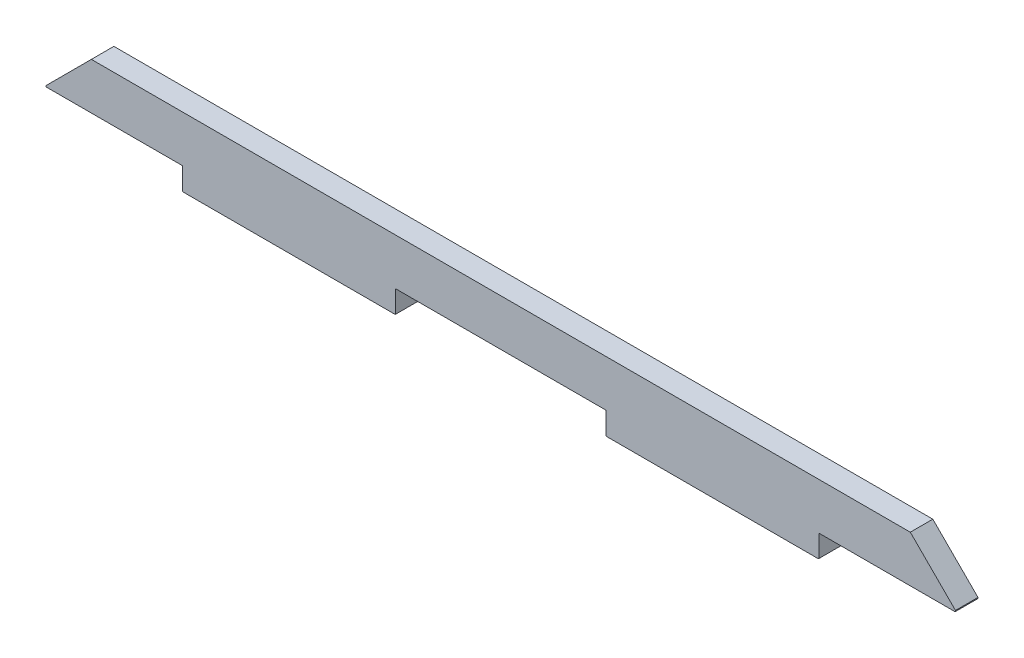
ISO-10303-21;
HEADER;
FILE_DESCRIPTION(('STEP AP214'),'2;1');
FILE_NAME('part.step','',(''),(''),'','','');
FILE_SCHEMA(('AUTOMOTIVE_DESIGN { 1 0 10303 214 1 1 1 1 }'));
ENDSEC;
DATA;
#1=APPLICATION_CONTEXT('core data for automotive mechanical design processes');
#2=APPLICATION_PROTOCOL_DEFINITION('international standard','automotive_design',2000,#1);
#3=PRODUCT_CONTEXT('',#1,'mechanical');
#4=PRODUCT('Part','Part','',(#3));
#5=PRODUCT_RELATED_PRODUCT_CATEGORY('part','',(#4));
#6=PRODUCT_DEFINITION_FORMATION('','',#4);
#7=PRODUCT_DEFINITION_CONTEXT('part definition',#1,'design');
#8=PRODUCT_DEFINITION('design','',#6,#7);
#9=PRODUCT_DEFINITION_SHAPE('','',#8);
#10=(LENGTH_UNIT() NAMED_UNIT(*) SI_UNIT(.MILLI.,.METRE.));
#11=(NAMED_UNIT(*) PLANE_ANGLE_UNIT() SI_UNIT($,.RADIAN.));
#12=(NAMED_UNIT(*) SI_UNIT($,.STERADIAN.) SOLID_ANGLE_UNIT());
#13=UNCERTAINTY_MEASURE_WITH_UNIT(LENGTH_MEASURE(1.E-05),#10,'distance_accuracy_value','');
#14=(GEOMETRIC_REPRESENTATION_CONTEXT(3) GLOBAL_UNCERTAINTY_ASSIGNED_CONTEXT((#13)) GLOBAL_UNIT_ASSIGNED_CONTEXT((#10,
#11,#12)) REPRESENTATION_CONTEXT('',''));
#15=CARTESIAN_POINT('',(0.,0.,0.));
#16=DIRECTION('',(0.,0.,1.));
#17=DIRECTION('',(1.,0.,0.));
#18=AXIS2_PLACEMENT_3D('',#15,#16,#17);
#19=CARTESIAN_POINT('',(526.686438993461,869.962897504305,3.));
#20=DIRECTION('',(-0.447213595502304,0.894427190998743,0.));
#21=DIRECTION('',(-0.894427190998743,-0.447213595502304,0.));
#22=AXIS2_PLACEMENT_3D('',#19,#20,#21);
#23=PLANE('',#22);
#24=DIRECTION('',(0.894427190998743,0.447213595502304,0.));
#25=VECTOR('',#24,1.);
#26=CARTESIAN_POINT('',(526.686438993461,869.962897504305,0.));
#27=LINE('',#26,#25);
#28=CARTESIAN_POINT('',(526.686438993461,869.962897504305,0.));
#29=VERTEX_POINT('',#28);
#30=CARTESIAN_POINT('',(526.737238993461,869.988297504305,0.));
#31=VERTEX_POINT('',#30);
#32=EDGE_CURVE('E281',#29,#31,#27,.T.);
#33=ORIENTED_EDGE('',*,*,#32,.T.);
#34=DIRECTION('',(0.,0.,-1.));
#35=VECTOR('',#34,1.);
#36=CARTESIAN_POINT('',(526.737238993461,869.988297504305,3.));
#37=LINE('',#36,#35);
#38=CARTESIAN_POINT('',(526.737238993461,869.988297504305,3.));
#39=VERTEX_POINT('',#38);
#40=EDGE_CURVE('E11',#39,#31,#37,.T.);
#41=ORIENTED_EDGE('',*,*,#40,.F.);
#42=DIRECTION('',(0.894427190998743,0.447213595502304,0.));
#43=VECTOR('',#42,1.);
#44=CARTESIAN_POINT('',(526.686438993461,869.962897504305,3.));
#45=LINE('',#44,#43);
#46=CARTESIAN_POINT('',(526.686438993461,869.962897504305,3.));
#47=VERTEX_POINT('',#46);
#48=EDGE_CURVE('E348',#47,#39,#45,.T.);
#49=ORIENTED_EDGE('',*,*,#48,.F.);
#50=DIRECTION('',(0.,0.,-1.));
#51=VECTOR('',#50,1.);
#52=CARTESIAN_POINT('',(526.686438993461,869.962897504305,3.));
#53=LINE('',#52,#51);
#54=EDGE_CURVE('E277',#47,#29,#53,.T.);
#55=ORIENTED_EDGE('',*,*,#54,.T.);
#56=EDGE_LOOP('',(#33,#41,#49,#55));
#57=FACE_BOUND('',#56,.T.);
#58=ADVANCED_FACE('F41',(#57),#23,.F.);
#59=CARTESIAN_POINT('',(526.737238993461,869.988297504305,3.));
#60=DIRECTION('',(-0.707106781183457,0.707106781189638,0.));
#61=DIRECTION('',(-0.707106781189638,-0.707106781183457,0.));
#62=AXIS2_PLACEMENT_3D('',#59,#60,#61);
#63=PLANE('',#62);
#64=DIRECTION('',(0.707106781189638,0.707106781183457,0.));
#65=VECTOR('',#64,1.);
#66=CARTESIAN_POINT('',(526.737238993461,869.988297504305,0.));
#67=LINE('',#66,#65);
#68=CARTESIAN_POINT('',(526.762638993461,870.013697504305,0.));
#69=VERTEX_POINT('',#68);
#70=EDGE_CURVE('E284',#31,#69,#67,.T.);
#71=ORIENTED_EDGE('',*,*,#70,.T.);
#72=DIRECTION('',(0.,0.,-1.));
#73=VECTOR('',#72,1.);
#74=CARTESIAN_POINT('',(526.762638993461,870.013697504305,3.));
#75=LINE('',#74,#73);
#76=CARTESIAN_POINT('',(526.762638993461,870.013697504305,3.));
#77=VERTEX_POINT('',#76);
#78=EDGE_CURVE('E49',#77,#69,#75,.T.);
#79=ORIENTED_EDGE('',*,*,#78,.F.);
#80=DIRECTION('',(0.707106781189638,0.707106781183457,0.));
#81=VECTOR('',#80,1.);
#82=CARTESIAN_POINT('',(526.737238993461,869.988297504305,3.));
#83=LINE('',#82,#81);
#84=EDGE_CURVE('E172',#39,#77,#83,.T.);
#85=ORIENTED_EDGE('',*,*,#84,.F.);
#86=ORIENTED_EDGE('',*,*,#40,.T.);
#87=EDGE_LOOP('',(#71,#79,#85,#86));
#88=FACE_BOUND('',#87,.T.);
#89=ADVANCED_FACE('F435',(#88),#63,.F.);
#90=CARTESIAN_POINT('',(526.762638993461,870.039097504305,3.));
#91=DIRECTION('',(-1.,0.,0.));
#92=DIRECTION('',(0.,0.,1.));
#93=AXIS2_PLACEMENT_3D('',#90,#91,#92);
#94=PLANE('',#93);
#95=DIRECTION('',(0.,1.,0.));
#96=VECTOR('',#95,1.);
#97=CARTESIAN_POINT('',(526.762638993461,870.039097504305,0.));
#98=LINE('',#97,#96);
#99=CARTESIAN_POINT('',(526.762638993461,872.960097504305,0.));
#100=VERTEX_POINT('',#99);
#101=EDGE_CURVE('E287',#69,#100,#98,.T.);
#102=ORIENTED_EDGE('',*,*,#101,.T.);
#103=DIRECTION('',(0.,0.,-1.));
#104=VECTOR('',#103,1.);
#105=CARTESIAN_POINT('',(526.762638993461,872.960097504305,3.));
#106=LINE('',#105,#104);
#107=CARTESIAN_POINT('',(526.762638993461,872.960097504305,3.));
#108=VERTEX_POINT('',#107);
#109=EDGE_CURVE('E427',#108,#100,#106,.T.);
#110=ORIENTED_EDGE('',*,*,#109,.F.);
#111=DIRECTION('',(0.,1.,0.));
#112=VECTOR('',#111,1.);
#113=CARTESIAN_POINT('',(526.762638993461,870.013697504305,3.));
#114=LINE('',#113,#112);
#115=EDGE_CURVE('E434',#77,#108,#114,.T.);
#116=ORIENTED_EDGE('',*,*,#115,.F.);
#117=ORIENTED_EDGE('',*,*,#78,.T.);
#118=EDGE_LOOP('',(#102,#110,#116,#117));
#119=FACE_BOUND('',#118,.T.);
#120=ADVANCED_FACE('F432',(#119),#94,.F.);
#121=CARTESIAN_POINT('',(526.762638993461,872.960097504305,3.));
#122=DIRECTION('',(0.,1.,0.));
#123=DIRECTION('',(0.,0.,1.));
#124=AXIS2_PLACEMENT_3D('',#121,#122,#123);
#125=PLANE('',#124);
#126=DIRECTION('',(1.,0.,0.));
#127=VECTOR('',#126,1.);
#128=CARTESIAN_POINT('',(526.762638993461,872.960097504305,0.));
#129=LINE('',#128,#127);
#130=CARTESIAN_POINT('',(554.778838993461,872.960097504305,0.));
#131=VERTEX_POINT('',#130);
#132=EDGE_CURVE('E289',#100,#131,#129,.T.);
#133=ORIENTED_EDGE('',*,*,#132,.T.);
#134=DIRECTION('',(0.,0.,-1.));
#135=VECTOR('',#134,1.);
#136=CARTESIAN_POINT('',(554.778838993461,872.960097504305,3.));
#137=LINE('',#136,#135);
#138=CARTESIAN_POINT('',(554.778838993461,872.960097504305,3.));
#139=VERTEX_POINT('',#138);
#140=EDGE_CURVE('E424',#139,#131,#137,.T.);
#141=ORIENTED_EDGE('',*,*,#140,.F.);
#142=DIRECTION('',(1.,0.,0.));
#143=VECTOR('',#142,1.);
#144=CARTESIAN_POINT('',(526.762638993461,872.960097504305,3.));
#145=LINE('',#144,#143);
#146=EDGE_CURVE('E454',#108,#139,#145,.T.);
#147=ORIENTED_EDGE('',*,*,#146,.F.);
#148=ORIENTED_EDGE('',*,*,#109,.T.);
#149=EDGE_LOOP('',(#133,#141,#147,#148));
#150=FACE_BOUND('',#149,.T.);
#151=ADVANCED_FACE('F445',(#150),#125,.F.);
#152=CARTESIAN_POINT('',(554.778838993461,872.960097504305,3.));
#153=DIRECTION('',(1.,0.,0.));
#154=DIRECTION('',(0.,0.,-1.));
#155=AXIS2_PLACEMENT_3D('',#152,#153,#154);
#156=PLANE('',#155);
#157=DIRECTION('',(0.,-1.,0.));
#158=VECTOR('',#157,1.);
#159=CARTESIAN_POINT('',(554.778838993461,872.960097504305,0.));
#160=LINE('',#159,#158);
#161=CARTESIAN_POINT('',(554.778838993461,870.039097504305,0.));
#162=VERTEX_POINT('',#161);
#163=EDGE_CURVE('E291',#131,#162,#160,.T.);
#164=ORIENTED_EDGE('',*,*,#163,.T.);
#165=DIRECTION('',(0.,0.,-1.));
#166=VECTOR('',#165,1.);
#167=CARTESIAN_POINT('',(554.778838993461,870.039097504305,3.));
#168=LINE('',#167,#166);
#169=CARTESIAN_POINT('',(554.778838993461,870.039097504305,3.));
#170=VERTEX_POINT('',#169);
#171=EDGE_CURVE('E421',#170,#162,#168,.T.);
#172=ORIENTED_EDGE('',*,*,#171,.F.);
#173=DIRECTION('',(0.,-1.,0.));
#174=VECTOR('',#173,1.);
#175=CARTESIAN_POINT('',(554.778838993461,872.960097504305,3.));
#176=LINE('',#175,#174);
#177=EDGE_CURVE('E451',#139,#170,#176,.T.);
#178=ORIENTED_EDGE('',*,*,#177,.F.);
#179=ORIENTED_EDGE('',*,*,#140,.T.);
#180=EDGE_LOOP('',(#164,#172,#178,#179));
#181=FACE_BOUND('',#180,.T.);
#182=ADVANCED_FACE('F449',(#181),#156,.F.);
#183=CARTESIAN_POINT('',(554.778838993461,870.039097504305,3.));
#184=DIRECTION('',(0.707106781185002,0.707106781188093,0.));
#185=DIRECTION('',(-0.707106781188093,0.707106781185002,0.));
#186=AXIS2_PLACEMENT_3D('',#183,#184,#185);
#187=PLANE('',#186);
#188=DIRECTION('',(0.707106781188093,-0.707106781185002,0.));
#189=VECTOR('',#188,1.);
#190=CARTESIAN_POINT('',(554.778838993461,870.039097504305,0.));
#191=LINE('',#190,#189);
#192=CARTESIAN_POINT('',(554.804238993461,870.013697504305,0.));
#193=VERTEX_POINT('',#192);
#194=EDGE_CURVE('E293',#162,#193,#191,.T.);
#195=ORIENTED_EDGE('',*,*,#194,.T.);
#196=DIRECTION('',(0.,0.,-1.));
#197=VECTOR('',#196,1.);
#198=CARTESIAN_POINT('',(554.804238993461,870.013697504305,3.));
#199=LINE('',#198,#197);
#200=CARTESIAN_POINT('',(554.804238993461,870.013697504305,3.));
#201=VERTEX_POINT('',#200);
#202=EDGE_CURVE('E418',#201,#193,#199,.T.);
#203=ORIENTED_EDGE('',*,*,#202,.F.);
#204=DIRECTION('',(0.707106781188093,-0.707106781185002,0.));
#205=VECTOR('',#204,1.);
#206=CARTESIAN_POINT('',(554.778838993461,870.039097504305,3.));
#207=LINE('',#206,#205);
#208=EDGE_CURVE('E453',#170,#201,#207,.T.);
#209=ORIENTED_EDGE('',*,*,#208,.F.);
#210=ORIENTED_EDGE('',*,*,#171,.T.);
#211=EDGE_LOOP('',(#195,#203,#209,#210));
#212=FACE_BOUND('',#211,.T.);
#213=ADVANCED_FACE('F614',(#212),#187,.F.);
#214=CARTESIAN_POINT('',(554.804238993461,870.013697504305,3.));
#215=DIRECTION('',(1.,0.,0.));
#216=DIRECTION('',(0.,0.,-1.));
#217=AXIS2_PLACEMENT_3D('',#214,#215,#216);
#218=PLANE('',#217);
#219=DIRECTION('',(0.,-1.,0.));
#220=VECTOR('',#219,1.);
#221=CARTESIAN_POINT('',(554.804238993461,870.013697504305,0.));
#222=LINE('',#221,#220);
#223=CARTESIAN_POINT('',(554.804238993461,869.988297504305,0.));
#224=VERTEX_POINT('',#223);
#225=EDGE_CURVE('E295',#193,#224,#222,.T.);
#226=ORIENTED_EDGE('',*,*,#225,.T.);
#227=DIRECTION('',(0.,0.,-1.));
#228=VECTOR('',#227,1.);
#229=CARTESIAN_POINT('',(554.804238993461,869.988297504305,3.));
#230=LINE('',#229,#228);
#231=CARTESIAN_POINT('',(554.804238993461,869.988297504305,3.));
#232=VERTEX_POINT('',#231);
#233=EDGE_CURVE('E415',#232,#224,#230,.T.);
#234=ORIENTED_EDGE('',*,*,#233,.F.);
#235=DIRECTION('',(0.,-1.,0.));
#236=VECTOR('',#235,1.);
#237=CARTESIAN_POINT('',(554.804238993461,870.013697504305,3.));
#238=LINE('',#237,#236);
#239=EDGE_CURVE('E456',#201,#232,#238,.T.);
#240=ORIENTED_EDGE('',*,*,#239,.F.);
#241=ORIENTED_EDGE('',*,*,#202,.T.);
#242=EDGE_LOOP('',(#226,#234,#240,#241));
#243=FACE_BOUND('',#242,.T.);
#244=ADVANCED_FACE('F611',(#243),#218,.F.);
#245=CARTESIAN_POINT('',(554.804238993461,869.988297504305,3.));
#246=DIRECTION('',(0.,1.,0.));
#247=DIRECTION('',(0.,0.,1.));
#248=AXIS2_PLACEMENT_3D('',#245,#246,#247);
#249=PLANE('',#248);
#250=DIRECTION('',(1.,0.,0.));
#251=VECTOR('',#250,1.);
#252=CARTESIAN_POINT('',(554.804238993461,869.988297504305,0.));
#253=LINE('',#252,#251);
#254=CARTESIAN_POINT('',(554.829638993461,869.988297504305,0.));
#255=VERTEX_POINT('',#254);
#256=EDGE_CURVE('E297',#224,#255,#253,.T.);
#257=ORIENTED_EDGE('',*,*,#256,.T.);
#258=DIRECTION('',(0.,0.,-1.));
#259=VECTOR('',#258,1.);
#260=CARTESIAN_POINT('',(554.829638993461,869.988297504305,3.));
#261=LINE('',#260,#259);
#262=CARTESIAN_POINT('',(554.829638993461,869.988297504305,3.));
#263=VERTEX_POINT('',#262);
#264=EDGE_CURVE('E412',#263,#255,#261,.T.);
#265=ORIENTED_EDGE('',*,*,#264,.F.);
#266=DIRECTION('',(1.,0.,0.));
#267=VECTOR('',#266,1.);
#268=CARTESIAN_POINT('',(554.804238993461,869.988297504305,3.));
#269=LINE('',#268,#267);
#270=EDGE_CURVE('E462',#232,#263,#269,.T.);
#271=ORIENTED_EDGE('',*,*,#270,.F.);
#272=ORIENTED_EDGE('',*,*,#233,.T.);
#273=EDGE_LOOP('',(#257,#265,#271,#272));
#274=FACE_BOUND('',#273,.T.);
#275=ADVANCED_FACE('F606',(#274),#249,.F.);
#276=CARTESIAN_POINT('',(554.829638993461,869.988297504305,3.));
#277=DIRECTION('',(0.707106781188093,0.707106781185002,0.));
#278=DIRECTION('',(-0.707106781185002,0.707106781188093,0.));
#279=AXIS2_PLACEMENT_3D('',#276,#277,#278);
#280=PLANE('',#279);
#281=DIRECTION('',(0.707106781185002,-0.707106781188093,0.));
#282=VECTOR('',#281,1.);
#283=CARTESIAN_POINT('',(554.829638993461,869.988297504305,0.));
#284=LINE('',#283,#282);
#285=CARTESIAN_POINT('',(554.855038993462,869.962897504305,0.));
#286=VERTEX_POINT('',#285);
#287=EDGE_CURVE('E299',#255,#286,#284,.T.);
#288=ORIENTED_EDGE('',*,*,#287,.T.);
#289=DIRECTION('',(0.,0.,-1.));
#290=VECTOR('',#289,1.);
#291=CARTESIAN_POINT('',(554.855038993462,869.962897504305,3.));
#292=LINE('',#291,#290);
#293=CARTESIAN_POINT('',(554.855038993462,869.962897504305,3.));
#294=VERTEX_POINT('',#293);
#295=EDGE_CURVE('E409',#294,#286,#292,.T.);
#296=ORIENTED_EDGE('',*,*,#295,.F.);
#297=DIRECTION('',(0.707106781185002,-0.707106781188093,0.));
#298=VECTOR('',#297,1.);
#299=CARTESIAN_POINT('',(554.829638993461,869.988297504305,3.));
#300=LINE('',#299,#298);
#301=EDGE_CURVE('E464',#263,#294,#300,.T.);
#302=ORIENTED_EDGE('',*,*,#301,.F.);
#303=ORIENTED_EDGE('',*,*,#264,.T.);
#304=EDGE_LOOP('',(#288,#296,#302,#303));
#305=FACE_BOUND('',#304,.T.);
#306=ADVANCED_FACE('F601',(#305),#280,.F.);
#307=CARTESIAN_POINT('',(554.855038993462,869.962897504305,3.));
#308=DIRECTION('',(0.,1.,0.));
#309=DIRECTION('',(0.,0.,1.));
#310=AXIS2_PLACEMENT_3D('',#307,#308,#309);
#311=PLANE('',#310);
#312=DIRECTION('',(1.,0.,0.));
#313=VECTOR('',#312,1.);
#314=CARTESIAN_POINT('',(554.855038993462,869.962897504305,0.));
#315=LINE('',#314,#313);
#316=CARTESIAN_POINT('',(583.074438993462,869.962897504305,0.));
#317=VERTEX_POINT('',#316);
#318=EDGE_CURVE('E301',#286,#317,#315,.T.);
#319=ORIENTED_EDGE('',*,*,#318,.T.);
#320=DIRECTION('',(0.,0.,-1.));
#321=VECTOR('',#320,1.);
#322=CARTESIAN_POINT('',(583.074438993462,869.962897504305,3.));
#323=LINE('',#322,#321);
#324=CARTESIAN_POINT('',(583.074438993462,869.962897504305,3.));
#325=VERTEX_POINT('',#324);
#326=EDGE_CURVE('E406',#325,#317,#323,.T.);
#327=ORIENTED_EDGE('',*,*,#326,.F.);
#328=DIRECTION('',(1.,0.,0.));
#329=VECTOR('',#328,1.);
#330=CARTESIAN_POINT('',(554.855038993462,869.962897504305,3.));
#331=LINE('',#330,#329);
#332=EDGE_CURVE('E466',#294,#325,#331,.T.);
#333=ORIENTED_EDGE('',*,*,#332,.F.);
#334=ORIENTED_EDGE('',*,*,#295,.T.);
#335=EDGE_LOOP('',(#319,#327,#333,#334));
#336=FACE_BOUND('',#335,.T.);
#337=ADVANCED_FACE('F597',(#336),#311,.F.);
#338=CARTESIAN_POINT('',(583.074438993462,869.962897504305,3.));
#339=DIRECTION('',(-0.447213595510123,0.894427190994833,0.));
#340=DIRECTION('',(-0.894427190994834,-0.447213595510123,0.));
#341=AXIS2_PLACEMENT_3D('',#338,#339,#340);
#342=PLANE('',#341);
#343=DIRECTION('',(0.894427190994833,0.447213595510123,0.));
#344=VECTOR('',#343,1.);
#345=CARTESIAN_POINT('',(583.074438993462,869.962897504305,0.));
#346=LINE('',#345,#344);
#347=CARTESIAN_POINT('',(583.125238993461,869.988297504305,0.));
#348=VERTEX_POINT('',#347);
#349=EDGE_CURVE('E303',#317,#348,#346,.T.);
#350=ORIENTED_EDGE('',*,*,#349,.T.);
#351=DIRECTION('',(0.,0.,-1.));
#352=VECTOR('',#351,1.);
#353=CARTESIAN_POINT('',(583.125238993461,869.988297504305,3.));
#354=LINE('',#353,#352);
#355=CARTESIAN_POINT('',(583.125238993461,869.988297504305,3.));
#356=VERTEX_POINT('',#355);
#357=EDGE_CURVE('E403',#356,#348,#354,.T.);
#358=ORIENTED_EDGE('',*,*,#357,.F.);
#359=DIRECTION('',(0.894427190994833,0.447213595510123,0.));
#360=VECTOR('',#359,1.);
#361=CARTESIAN_POINT('',(583.074438993462,869.962897504305,3.));
#362=LINE('',#361,#360);
#363=EDGE_CURVE('E468',#325,#356,#362,.T.);
#364=ORIENTED_EDGE('',*,*,#363,.F.);
#365=ORIENTED_EDGE('',*,*,#326,.T.);
#366=EDGE_LOOP('',(#350,#358,#364,#365));
#367=FACE_BOUND('',#366,.T.);
#368=ADVANCED_FACE('F592',(#367),#342,.F.);
#369=CARTESIAN_POINT('',(583.125238993461,869.988297504305,3.));
#370=DIRECTION('',(-0.707106781183457,0.707106781189638,0.));
#371=DIRECTION('',(-0.707106781189638,-0.707106781183457,0.));
#372=AXIS2_PLACEMENT_3D('',#369,#370,#371);
#373=PLANE('',#372);
#374=DIRECTION('',(0.707106781189638,0.707106781183457,0.));
#375=VECTOR('',#374,1.);
#376=CARTESIAN_POINT('',(583.125238993461,869.988297504305,0.));
#377=LINE('',#376,#375);
#378=CARTESIAN_POINT('',(583.150638993461,870.013697504305,0.));
#379=VERTEX_POINT('',#378);
#380=EDGE_CURVE('E305',#348,#379,#377,.T.);
#381=ORIENTED_EDGE('',*,*,#380,.T.);
#382=DIRECTION('',(0.,0.,-1.));
#383=VECTOR('',#382,1.);
#384=CARTESIAN_POINT('',(583.150638993461,870.013697504305,3.));
#385=LINE('',#384,#383);
#386=CARTESIAN_POINT('',(583.150638993461,870.013697504305,3.));
#387=VERTEX_POINT('',#386);
#388=EDGE_CURVE('E400',#387,#379,#385,.T.);
#389=ORIENTED_EDGE('',*,*,#388,.F.);
#390=DIRECTION('',(0.707106781189638,0.707106781183457,0.));
#391=VECTOR('',#390,1.);
#392=CARTESIAN_POINT('',(583.125238993461,869.988297504305,3.));
#393=LINE('',#392,#391);
#394=EDGE_CURVE('E470',#356,#387,#393,.T.);
#395=ORIENTED_EDGE('',*,*,#394,.F.);
#396=ORIENTED_EDGE('',*,*,#357,.T.);
#397=EDGE_LOOP('',(#381,#389,#395,#396));
#398=FACE_BOUND('',#397,.T.);
#399=ADVANCED_FACE('F586',(#398),#373,.F.);
#400=CARTESIAN_POINT('',(583.150638993461,870.039097504305,3.));
#401=DIRECTION('',(-1.,0.,0.));
#402=DIRECTION('',(0.,0.,1.));
#403=AXIS2_PLACEMENT_3D('',#400,#401,#402);
#404=PLANE('',#403);
#405=DIRECTION('',(0.,1.,0.));
#406=VECTOR('',#405,1.);
#407=CARTESIAN_POINT('',(583.150638993461,870.039097504305,0.));
#408=LINE('',#407,#406);
#409=CARTESIAN_POINT('',(583.150638993461,872.960097504305,0.));
#410=VERTEX_POINT('',#409);
#411=EDGE_CURVE('E308',#379,#410,#408,.T.);
#412=ORIENTED_EDGE('',*,*,#411,.T.);
#413=DIRECTION('',(0.,0.,-1.));
#414=VECTOR('',#413,1.);
#415=CARTESIAN_POINT('',(583.150638993461,872.960097504305,3.));
#416=LINE('',#415,#414);
#417=CARTESIAN_POINT('',(583.150638993461,872.960097504305,3.));
#418=VERTEX_POINT('',#417);
#419=EDGE_CURVE('E397',#418,#410,#416,.T.);
#420=ORIENTED_EDGE('',*,*,#419,.F.);
#421=DIRECTION('',(0.,1.,0.));
#422=VECTOR('',#421,1.);
#423=CARTESIAN_POINT('',(583.150638993461,870.013697504305,3.));
#424=LINE('',#423,#422);
#425=EDGE_CURVE('E472',#387,#418,#424,.T.);
#426=ORIENTED_EDGE('',*,*,#425,.F.);
#427=ORIENTED_EDGE('',*,*,#388,.T.);
#428=EDGE_LOOP('',(#412,#420,#426,#427));
#429=FACE_BOUND('',#428,.T.);
#430=ADVANCED_FACE('F582',(#429),#404,.F.);
#431=CARTESIAN_POINT('',(583.150638993461,872.960097504305,3.));
#432=DIRECTION('',(0.,1.,0.));
#433=DIRECTION('',(0.,0.,1.));
#434=AXIS2_PLACEMENT_3D('',#431,#432,#433);
#435=PLANE('',#434);
#436=DIRECTION('',(1.,0.,0.));
#437=VECTOR('',#436,1.);
#438=CARTESIAN_POINT('',(583.150638993461,872.960097504305,0.));
#439=LINE('',#438,#437);
#440=CARTESIAN_POINT('',(601.286238993462,872.960097504305,0.));
#441=VERTEX_POINT('',#440);
#442=EDGE_CURVE('E310',#410,#441,#439,.T.);
#443=ORIENTED_EDGE('',*,*,#442,.T.);
#444=DIRECTION('',(0.,0.,-1.));
#445=VECTOR('',#444,1.);
#446=CARTESIAN_POINT('',(601.286238993462,872.960097504305,3.));
#447=LINE('',#446,#445);
#448=CARTESIAN_POINT('',(601.286238993462,872.960097504305,3.));
#449=VERTEX_POINT('',#448);
#450=EDGE_CURVE('E394',#449,#441,#447,.T.);
#451=ORIENTED_EDGE('',*,*,#450,.F.);
#452=DIRECTION('',(1.,0.,0.));
#453=VECTOR('',#452,1.);
#454=CARTESIAN_POINT('',(583.150638993461,872.960097504305,3.));
#455=LINE('',#454,#453);
#456=EDGE_CURVE('E474',#418,#449,#455,.T.);
#457=ORIENTED_EDGE('',*,*,#456,.F.);
#458=ORIENTED_EDGE('',*,*,#419,.T.);
#459=EDGE_LOOP('',(#443,#451,#457,#458));
#460=FACE_BOUND('',#459,.T.);
#461=ADVANCED_FACE('F577',(#460),#435,.F.);
#462=CARTESIAN_POINT('',(601.286238993462,872.960097504305,3.));
#463=DIRECTION('',(-0.447213595499176,0.894427191000307,0.));
#464=DIRECTION('',(-0.894427191000307,-0.447213595499176,0.));
#465=AXIS2_PLACEMENT_3D('',#462,#463,#464);
#466=PLANE('',#465);
#467=DIRECTION('',(0.894427191000307,0.447213595499176,0.));
#468=VECTOR('',#467,1.);
#469=CARTESIAN_POINT('',(601.286238993462,872.960097504305,0.));
#470=LINE('',#469,#468);
#471=CARTESIAN_POINT('',(601.337038993462,872.985497504305,0.));
#472=VERTEX_POINT('',#471);
#473=EDGE_CURVE('E312',#441,#472,#470,.T.);
#474=ORIENTED_EDGE('',*,*,#473,.T.);
#475=DIRECTION('',(0.,0.,-1.));
#476=VECTOR('',#475,1.);
#477=CARTESIAN_POINT('',(601.337038993462,872.985497504305,3.));
#478=LINE('',#477,#476);
#479=CARTESIAN_POINT('',(601.337038993462,872.985497504305,3.));
#480=VERTEX_POINT('',#479);
#481=EDGE_CURVE('E391',#480,#472,#478,.T.);
#482=ORIENTED_EDGE('',*,*,#481,.F.);
#483=DIRECTION('',(0.894427191000307,0.447213595499176,0.));
#484=VECTOR('',#483,1.);
#485=CARTESIAN_POINT('',(601.286238993462,872.960097504305,3.));
#486=LINE('',#485,#484);
#487=EDGE_CURVE('E476',#449,#480,#486,.T.);
#488=ORIENTED_EDGE('',*,*,#487,.F.);
#489=ORIENTED_EDGE('',*,*,#450,.T.);
#490=EDGE_LOOP('',(#474,#482,#488,#489));
#491=FACE_BOUND('',#490,.T.);
#492=ADVANCED_FACE('F572',(#491),#466,.F.);
#493=CARTESIAN_POINT('',(601.337038993462,872.985497504305,3.));
#494=DIRECTION('',(-0.707106781202001,0.707106781171094,0.));
#495=DIRECTION('',(-0.707106781171094,-0.707106781202001,0.));
#496=AXIS2_PLACEMENT_3D('',#493,#494,#495);
#497=PLANE('',#496);
#498=DIRECTION('',(0.707106781171094,0.707106781202001,0.));
#499=VECTOR('',#498,1.);
#500=CARTESIAN_POINT('',(601.337038993462,872.985497504305,0.));
#501=LINE('',#500,#499);
#502=CARTESIAN_POINT('',(601.362438993461,873.010897504305,0.));
#503=VERTEX_POINT('',#502);
#504=EDGE_CURVE('E314',#472,#503,#501,.T.);
#505=ORIENTED_EDGE('',*,*,#504,.T.);
#506=DIRECTION('',(0.,0.,-1.));
#507=VECTOR('',#506,1.);
#508=CARTESIAN_POINT('',(601.362438993461,873.010897504305,3.));
#509=LINE('',#508,#507);
#510=CARTESIAN_POINT('',(601.362438993461,873.010897504305,3.));
#511=VERTEX_POINT('',#510);
#512=EDGE_CURVE('E388',#511,#503,#509,.T.);
#513=ORIENTED_EDGE('',*,*,#512,.F.);
#514=DIRECTION('',(0.707106781171094,0.707106781202001,0.));
#515=VECTOR('',#514,1.);
#516=CARTESIAN_POINT('',(601.337038993462,872.985497504305,3.));
#517=LINE('',#516,#515);
#518=EDGE_CURVE('E478',#480,#511,#517,.T.);
#519=ORIENTED_EDGE('',*,*,#518,.F.);
#520=ORIENTED_EDGE('',*,*,#481,.T.);
#521=EDGE_LOOP('',(#505,#513,#519,#520));
#522=FACE_BOUND('',#521,.T.);
#523=ADVANCED_FACE('F568',(#522),#497,.F.);
#524=CARTESIAN_POINT('',(601.362438993461,873.087097504305,3.));
#525=DIRECTION('',(-1.,0.,0.));
#526=DIRECTION('',(0.,0.,1.));
#527=AXIS2_PLACEMENT_3D('',#524,#525,#526);
#528=PLANE('',#527);
#529=DIRECTION('',(0.,1.,0.));
#530=VECTOR('',#529,1.);
#531=CARTESIAN_POINT('',(601.362438993461,873.087097504305,0.));
#532=LINE('',#531,#530);
#533=CARTESIAN_POINT('',(601.362438993461,873.137897504305,0.));
#534=VERTEX_POINT('',#533);
#535=EDGE_CURVE('E317',#503,#534,#532,.T.);
#536=ORIENTED_EDGE('',*,*,#535,.T.);
#537=DIRECTION('',(0.,0.,-1.));
#538=VECTOR('',#537,1.);
#539=CARTESIAN_POINT('',(601.362438993461,873.137897504305,3.));
#540=LINE('',#539,#538);
#541=CARTESIAN_POINT('',(601.362438993461,873.137897504305,3.));
#542=VERTEX_POINT('',#541);
#543=EDGE_CURVE('E385',#542,#534,#540,.T.);
#544=ORIENTED_EDGE('',*,*,#543,.F.);
#545=DIRECTION('',(0.,1.,0.));
#546=VECTOR('',#545,1.);
#547=CARTESIAN_POINT('',(601.362438993461,873.010897504305,3.));
#548=LINE('',#547,#546);
#549=EDGE_CURVE('E480',#511,#542,#548,.T.);
#550=ORIENTED_EDGE('',*,*,#549,.F.);
#551=ORIENTED_EDGE('',*,*,#512,.T.);
#552=EDGE_LOOP('',(#536,#544,#550,#551));
#553=FACE_BOUND('',#552,.T.);
#554=ADVANCED_FACE('F564',(#553),#528,.F.);
#555=CARTESIAN_POINT('',(601.362438993461,873.137897504305,3.));
#556=DIRECTION('',(-0.707106781186587,-0.707106781186508,0.));
#557=DIRECTION('',(0.707106781186508,-0.707106781186587,0.));
#558=AXIS2_PLACEMENT_3D('',#555,#556,#557);
#559=PLANE('',#558);
#560=DIRECTION('',(-0.707106781186508,0.707106781186587,0.));
#561=VECTOR('',#560,1.);
#562=CARTESIAN_POINT('',(601.362438993461,873.137897504305,0.));
#563=LINE('',#562,#561);
#564=CARTESIAN_POINT('',(595.342638993461,879.157697504305,0.));
#565=VERTEX_POINT('',#564);
#566=EDGE_CURVE('E319',#534,#565,#563,.T.);
#567=ORIENTED_EDGE('',*,*,#566,.T.);
#568=DIRECTION('',(0.,0.,-1.));
#569=VECTOR('',#568,1.);
#570=CARTESIAN_POINT('',(595.342638993461,879.157697504305,3.));
#571=LINE('',#570,#569);
#572=CARTESIAN_POINT('',(595.342638993461,879.157697504305,3.));
#573=VERTEX_POINT('',#572);
#574=EDGE_CURVE('E382',#573,#565,#571,.T.);
#575=ORIENTED_EDGE('',*,*,#574,.F.);
#576=DIRECTION('',(-0.707106781186508,0.707106781186587,0.));
#577=VECTOR('',#576,1.);
#578=CARTESIAN_POINT('',(601.362438993461,873.137897504305,3.));
#579=LINE('',#578,#577);
#580=EDGE_CURVE('E482',#542,#573,#579,.T.);
#581=ORIENTED_EDGE('',*,*,#580,.F.);
#582=ORIENTED_EDGE('',*,*,#543,.T.);
#583=EDGE_LOOP('',(#567,#575,#581,#582));
#584=FACE_BOUND('',#583,.T.);
#585=ADVANCED_FACE('F555',(#584),#559,.F.);
#586=CARTESIAN_POINT('',(486.249638993461,879.157697504305,3.));
#587=DIRECTION('',(0.,-1.,0.));
#588=DIRECTION('',(0.,0.,-1.));
#589=AXIS2_PLACEMENT_3D('',#586,#587,#588);
#590=PLANE('',#589);
#591=DIRECTION('',(-1.,0.,0.));
#592=VECTOR('',#591,1.);
#593=CARTESIAN_POINT('',(486.249638993461,879.157697504305,0.));
#594=LINE('',#593,#592);
#595=CARTESIAN_POINT('',(486.224238993461,879.157697504305,0.));
#596=VERTEX_POINT('',#595);
#597=EDGE_CURVE('E322',#565,#596,#594,.T.);
#598=ORIENTED_EDGE('',*,*,#597,.T.);
#599=DIRECTION('',(0.,0.,-1.));
#600=VECTOR('',#599,1.);
#601=CARTESIAN_POINT('',(486.224238993461,879.157697504305,3.));
#602=LINE('',#601,#600);
#603=CARTESIAN_POINT('',(486.224238993461,879.157697504305,3.));
#604=VERTEX_POINT('',#603);
#605=EDGE_CURVE('E379',#604,#596,#602,.T.);
#606=ORIENTED_EDGE('',*,*,#605,.F.);
#607=DIRECTION('',(-1.,0.,0.));
#608=VECTOR('',#607,1.);
#609=CARTESIAN_POINT('',(595.342638993461,879.157697504305,3.));
#610=LINE('',#609,#608);
#611=EDGE_CURVE('E484',#573,#604,#610,.T.);
#612=ORIENTED_EDGE('',*,*,#611,.F.);
#613=ORIENTED_EDGE('',*,*,#574,.T.);
#614=EDGE_LOOP('',(#598,#606,#612,#613));
#615=FACE_BOUND('',#614,.T.);
#616=ADVANCED_FACE('F559',(#615),#590,.F.);
#617=CARTESIAN_POINT('',(486.224238993461,879.157697504305,3.));
#618=DIRECTION('',(0.707106781186564,-0.707106781186531,0.));
#619=DIRECTION('',(0.707106781186531,0.707106781186564,0.));
#620=AXIS2_PLACEMENT_3D('',#617,#618,#619);
#621=PLANE('',#620);
#622=DIRECTION('',(-0.707106781186531,-0.707106781186564,0.));
#623=VECTOR('',#622,1.);
#624=CARTESIAN_POINT('',(486.224238993461,879.157697504305,0.));
#625=LINE('',#624,#623);
#626=CARTESIAN_POINT('',(480.204438993461,873.137897504305,0.));
#627=VERTEX_POINT('',#626);
#628=EDGE_CURVE('E324',#596,#627,#625,.T.);
#629=ORIENTED_EDGE('',*,*,#628,.T.);
#630=DIRECTION('',(0.,0.,-1.));
#631=VECTOR('',#630,1.);
#632=CARTESIAN_POINT('',(480.204438993461,873.137897504305,3.));
#633=LINE('',#632,#631);
#634=CARTESIAN_POINT('',(480.204438993461,873.137897504305,3.));
#635=VERTEX_POINT('',#634);
#636=EDGE_CURVE('E376',#635,#627,#633,.T.);
#637=ORIENTED_EDGE('',*,*,#636,.F.);
#638=DIRECTION('',(-0.707106781186531,-0.707106781186564,0.));
#639=VECTOR('',#638,1.);
#640=CARTESIAN_POINT('',(486.224238993461,879.157697504305,3.));
#641=LINE('',#640,#639);
#642=EDGE_CURVE('E486',#604,#635,#641,.T.);
#643=ORIENTED_EDGE('',*,*,#642,.F.);
#644=ORIENTED_EDGE('',*,*,#605,.T.);
#645=EDGE_LOOP('',(#629,#637,#643,#644));
#646=FACE_BOUND('',#645,.T.);
#647=ADVANCED_FACE('F549',(#646),#621,.F.);
#648=CARTESIAN_POINT('',(480.204438993461,873.137897504305,3.));
#649=DIRECTION('',(0.894427190999525,-0.44721359550074,0.));
#650=DIRECTION('',(0.44721359550074,0.894427190999525,0.));
#651=AXIS2_PLACEMENT_3D('',#648,#649,#650);
#652=PLANE('',#651);
#653=DIRECTION('',(-0.44721359550074,-0.894427190999525,0.));
#654=VECTOR('',#653,1.);
#655=CARTESIAN_POINT('',(480.204438993461,873.137897504305,0.));
#656=LINE('',#655,#654);
#657=CARTESIAN_POINT('',(480.179038993461,873.087097504305,0.));
#658=VERTEX_POINT('',#657);
#659=EDGE_CURVE('E326',#627,#658,#656,.T.);
#660=ORIENTED_EDGE('',*,*,#659,.T.);
#661=DIRECTION('',(0.,0.,-1.));
#662=VECTOR('',#661,1.);
#663=CARTESIAN_POINT('',(480.179038993461,873.087097504305,3.));
#664=LINE('',#663,#662);
#665=CARTESIAN_POINT('',(480.179038993461,873.087097504305,3.));
#666=VERTEX_POINT('',#665);
#667=EDGE_CURVE('E373',#666,#658,#664,.T.);
#668=ORIENTED_EDGE('',*,*,#667,.F.);
#669=DIRECTION('',(-0.44721359550074,-0.894427190999525,0.));
#670=VECTOR('',#669,1.);
#671=CARTESIAN_POINT('',(480.204438993461,873.137897504305,3.));
#672=LINE('',#671,#670);
#673=EDGE_CURVE('E488',#635,#666,#672,.T.);
#674=ORIENTED_EDGE('',*,*,#673,.F.);
#675=ORIENTED_EDGE('',*,*,#636,.T.);
#676=EDGE_LOOP('',(#660,#668,#674,#675));
#677=FACE_BOUND('',#676,.T.);
#678=ADVANCED_FACE('F545',(#677),#652,.F.);
#679=CARTESIAN_POINT('',(480.179038993461,873.087097504305,3.));
#680=DIRECTION('',(1.,0.,0.));
#681=DIRECTION('',(0.,0.,-1.));
#682=AXIS2_PLACEMENT_3D('',#679,#680,#681);
#683=PLANE('',#682);
#684=DIRECTION('',(0.,-1.,0.));
#685=VECTOR('',#684,1.);
#686=CARTESIAN_POINT('',(480.179038993461,873.087097504305,0.));
#687=LINE('',#686,#685);
#688=CARTESIAN_POINT('',(480.179038993461,873.036297504305,0.));
#689=VERTEX_POINT('',#688);
#690=EDGE_CURVE('E328',#658,#689,#687,.T.);
#691=ORIENTED_EDGE('',*,*,#690,.T.);
#692=DIRECTION('',(0.,0.,-1.));
#693=VECTOR('',#692,1.);
#694=CARTESIAN_POINT('',(480.179038993461,873.036297504305,3.));
#695=LINE('',#694,#693);
#696=CARTESIAN_POINT('',(480.179038993461,873.036297504305,3.));
#697=VERTEX_POINT('',#696);
#698=EDGE_CURVE('E370',#697,#689,#695,.T.);
#699=ORIENTED_EDGE('',*,*,#698,.F.);
#700=DIRECTION('',(0.,-1.,0.));
#701=VECTOR('',#700,1.);
#702=CARTESIAN_POINT('',(480.179038993461,873.087097504305,3.));
#703=LINE('',#702,#701);
#704=EDGE_CURVE('E490',#666,#697,#703,.T.);
#705=ORIENTED_EDGE('',*,*,#704,.F.);
#706=ORIENTED_EDGE('',*,*,#667,.T.);
#707=EDGE_LOOP('',(#691,#699,#705,#706));
#708=FACE_BOUND('',#707,.T.);
#709=ADVANCED_FACE('F540',(#708),#683,.F.);
#710=CARTESIAN_POINT('',(480.179038993461,873.036297504305,3.));
#711=DIRECTION('',(0.70710678118732,0.707106781185775,0.));
#712=DIRECTION('',(-0.707106781185775,0.70710678118732,0.));
#713=AXIS2_PLACEMENT_3D('',#710,#711,#712);
#714=PLANE('',#713);
#715=DIRECTION('',(0.707106781185775,-0.70710678118732,0.));
#716=VECTOR('',#715,1.);
#717=CARTESIAN_POINT('',(480.179038993461,873.036297504305,0.));
#718=LINE('',#717,#716);
#719=CARTESIAN_POINT('',(480.204438993461,873.010897504305,0.));
#720=VERTEX_POINT('',#719);
#721=EDGE_CURVE('E330',#689,#720,#718,.T.);
#722=ORIENTED_EDGE('',*,*,#721,.T.);
#723=DIRECTION('',(0.,0.,-1.));
#724=VECTOR('',#723,1.);
#725=CARTESIAN_POINT('',(480.204438993461,873.010897504305,3.));
#726=LINE('',#725,#724);
#727=CARTESIAN_POINT('',(480.204438993461,873.010897504305,3.));
#728=VERTEX_POINT('',#727);
#729=EDGE_CURVE('E367',#728,#720,#726,.T.);
#730=ORIENTED_EDGE('',*,*,#729,.F.);
#731=DIRECTION('',(0.707106781185775,-0.70710678118732,0.));
#732=VECTOR('',#731,1.);
#733=CARTESIAN_POINT('',(480.179038993461,873.036297504305,3.));
#734=LINE('',#733,#732);
#735=EDGE_CURVE('E492',#697,#728,#734,.T.);
#736=ORIENTED_EDGE('',*,*,#735,.F.);
#737=ORIENTED_EDGE('',*,*,#698,.T.);
#738=EDGE_LOOP('',(#722,#730,#736,#737));
#739=FACE_BOUND('',#738,.T.);
#740=ADVANCED_FACE('F534',(#739),#714,.F.);
#741=CARTESIAN_POINT('',(480.204438993461,873.010897504305,3.));
#742=DIRECTION('',(1.,0.,0.));
#743=DIRECTION('',(0.,0.,-1.));
#744=AXIS2_PLACEMENT_3D('',#741,#742,#743);
#745=PLANE('',#744);
#746=DIRECTION('',(0.,-1.,0.));
#747=VECTOR('',#746,1.);
#748=CARTESIAN_POINT('',(480.204438993461,873.010897504305,0.));
#749=LINE('',#748,#747);
#750=CARTESIAN_POINT('',(480.204438993461,872.985497504305,0.));
#751=VERTEX_POINT('',#750);
#752=EDGE_CURVE('E332',#720,#751,#749,.T.);
#753=ORIENTED_EDGE('',*,*,#752,.T.);
#754=DIRECTION('',(0.,0.,-1.));
#755=VECTOR('',#754,1.);
#756=CARTESIAN_POINT('',(480.204438993461,872.985497504305,3.));
#757=LINE('',#756,#755);
#758=CARTESIAN_POINT('',(480.204438993461,872.985497504305,3.));
#759=VERTEX_POINT('',#758);
#760=EDGE_CURVE('E364',#759,#751,#757,.T.);
#761=ORIENTED_EDGE('',*,*,#760,.F.);
#762=DIRECTION('',(0.,-1.,0.));
#763=VECTOR('',#762,1.);
#764=CARTESIAN_POINT('',(480.204438993461,873.010897504305,3.));
#765=LINE('',#764,#763);
#766=EDGE_CURVE('E494',#728,#759,#765,.T.);
#767=ORIENTED_EDGE('',*,*,#766,.F.);
#768=ORIENTED_EDGE('',*,*,#729,.T.);
#769=EDGE_LOOP('',(#753,#761,#767,#768));
#770=FACE_BOUND('',#769,.T.);
#771=ADVANCED_FACE('F530',(#770),#745,.F.);
#772=CARTESIAN_POINT('',(480.204438993461,872.985497504305,3.));
#773=DIRECTION('',(0.,1.,0.));
#774=DIRECTION('',(0.,0.,1.));
#775=AXIS2_PLACEMENT_3D('',#772,#773,#774);
#776=PLANE('',#775);
#777=DIRECTION('',(1.,0.,0.));
#778=VECTOR('',#777,1.);
#779=CARTESIAN_POINT('',(480.204438993461,872.985497504305,0.));
#780=LINE('',#779,#778);
#781=CARTESIAN_POINT('',(480.255238993461,872.985497504305,0.));
#782=VERTEX_POINT('',#781);
#783=EDGE_CURVE('E334',#751,#782,#780,.T.);
#784=ORIENTED_EDGE('',*,*,#783,.T.);
#785=DIRECTION('',(0.,0.,-1.));
#786=VECTOR('',#785,1.);
#787=CARTESIAN_POINT('',(480.255238993461,872.985497504305,3.));
#788=LINE('',#787,#786);
#789=CARTESIAN_POINT('',(480.255238993461,872.985497504305,3.));
#790=VERTEX_POINT('',#789);
#791=EDGE_CURVE('E361',#790,#782,#788,.T.);
#792=ORIENTED_EDGE('',*,*,#791,.F.);
#793=DIRECTION('',(1.,0.,0.));
#794=VECTOR('',#793,1.);
#795=CARTESIAN_POINT('',(480.204438993461,872.985497504305,3.));
#796=LINE('',#795,#794);
#797=EDGE_CURVE('E496',#759,#790,#796,.T.);
#798=ORIENTED_EDGE('',*,*,#797,.F.);
#799=ORIENTED_EDGE('',*,*,#760,.T.);
#800=EDGE_LOOP('',(#784,#792,#798,#799));
#801=FACE_BOUND('',#800,.T.);
#802=ADVANCED_FACE('F525',(#801),#776,.F.);
#803=CARTESIAN_POINT('',(480.255238993461,872.985497504305,3.));
#804=DIRECTION('',(1.,0.,0.));
#805=DIRECTION('',(0.,0.,-1.));
#806=AXIS2_PLACEMENT_3D('',#803,#804,#805);
#807=PLANE('',#806);
#808=DIRECTION('',(0.,-1.,0.));
#809=VECTOR('',#808,1.);
#810=CARTESIAN_POINT('',(480.255238993461,872.985497504305,0.));
#811=LINE('',#810,#809);
#812=CARTESIAN_POINT('',(480.255238993461,872.960097504305,0.));
#813=VERTEX_POINT('',#812);
#814=EDGE_CURVE('E336',#782,#813,#811,.T.);
#815=ORIENTED_EDGE('',*,*,#814,.T.);
#816=DIRECTION('',(0.,0.,-1.));
#817=VECTOR('',#816,1.);
#818=CARTESIAN_POINT('',(480.255238993461,872.960097504305,3.));
#819=LINE('',#818,#817);
#820=CARTESIAN_POINT('',(480.255238993461,872.960097504305,3.));
#821=VERTEX_POINT('',#820);
#822=EDGE_CURVE('E358',#821,#813,#819,.T.);
#823=ORIENTED_EDGE('',*,*,#822,.F.);
#824=DIRECTION('',(0.,-1.,0.));
#825=VECTOR('',#824,1.);
#826=CARTESIAN_POINT('',(480.255238993461,872.985497504305,3.));
#827=LINE('',#826,#825);
#828=EDGE_CURVE('E498',#790,#821,#827,.T.);
#829=ORIENTED_EDGE('',*,*,#828,.F.);
#830=ORIENTED_EDGE('',*,*,#791,.T.);
#831=EDGE_LOOP('',(#815,#823,#829,#830));
#832=FACE_BOUND('',#831,.T.);
#833=ADVANCED_FACE('F519',(#832),#807,.F.);
#834=CARTESIAN_POINT('',(480.255238993461,872.960097504305,3.));
#835=DIRECTION('',(0.,1.,0.));
#836=DIRECTION('',(0.,0.,1.));
#837=AXIS2_PLACEMENT_3D('',#834,#835,#836);
#838=PLANE('',#837);
#839=DIRECTION('',(1.,0.,0.));
#840=VECTOR('',#839,1.);
#841=CARTESIAN_POINT('',(480.255238993461,872.960097504305,0.));
#842=LINE('',#841,#840);
#843=CARTESIAN_POINT('',(498.390838993461,872.960097504305,0.));
#844=VERTEX_POINT('',#843);
#845=EDGE_CURVE('E338',#813,#844,#842,.T.);
#846=ORIENTED_EDGE('',*,*,#845,.T.);
#847=DIRECTION('',(0.,0.,-1.));
#848=VECTOR('',#847,1.);
#849=CARTESIAN_POINT('',(498.390838993461,872.960097504305,3.));
#850=LINE('',#849,#848);
#851=CARTESIAN_POINT('',(498.390838993461,872.960097504305,3.));
#852=VERTEX_POINT('',#851);
#853=EDGE_CURVE('E355',#852,#844,#850,.T.);
#854=ORIENTED_EDGE('',*,*,#853,.F.);
#855=DIRECTION('',(1.,0.,0.));
#856=VECTOR('',#855,1.);
#857=CARTESIAN_POINT('',(480.255238993461,872.960097504305,3.));
#858=LINE('',#857,#856);
#859=EDGE_CURVE('E500',#821,#852,#858,.T.);
#860=ORIENTED_EDGE('',*,*,#859,.F.);
#861=ORIENTED_EDGE('',*,*,#822,.T.);
#862=EDGE_LOOP('',(#846,#854,#860,#861));
#863=FACE_BOUND('',#862,.T.);
#864=ADVANCED_FACE('F515',(#863),#838,.F.);
#865=CARTESIAN_POINT('',(498.390838993461,870.039097504305,3.));
#866=DIRECTION('',(1.,0.,0.));
#867=DIRECTION('',(0.,0.,-1.));
#868=AXIS2_PLACEMENT_3D('',#865,#866,#867);
#869=PLANE('',#868);
#870=DIRECTION('',(0.,-1.,0.));
#871=VECTOR('',#870,1.);
#872=CARTESIAN_POINT('',(498.390838993461,870.039097504305,0.));
#873=LINE('',#872,#871);
#874=CARTESIAN_POINT('',(498.390838993461,870.013697504305,0.));
#875=VERTEX_POINT('',#874);
#876=EDGE_CURVE('E341',#844,#875,#873,.T.);
#877=ORIENTED_EDGE('',*,*,#876,.T.);
#878=DIRECTION('',(0.,0.,-1.));
#879=VECTOR('',#878,1.);
#880=CARTESIAN_POINT('',(498.390838993461,870.013697504305,3.));
#881=LINE('',#880,#879);
#882=CARTESIAN_POINT('',(498.390838993461,870.013697504305,3.));
#883=VERTEX_POINT('',#882);
#884=EDGE_CURVE('E352',#883,#875,#881,.T.);
#885=ORIENTED_EDGE('',*,*,#884,.F.);
#886=DIRECTION('',(0.,-1.,0.));
#887=VECTOR('',#886,1.);
#888=CARTESIAN_POINT('',(498.390838993461,872.960097504305,3.));
#889=LINE('',#888,#887);
#890=EDGE_CURVE('E502',#852,#883,#889,.T.);
#891=ORIENTED_EDGE('',*,*,#890,.F.);
#892=ORIENTED_EDGE('',*,*,#853,.T.);
#893=EDGE_LOOP('',(#877,#885,#891,#892));
#894=FACE_BOUND('',#893,.T.);
#895=ADVANCED_FACE('F508',(#894),#869,.F.);
#896=CARTESIAN_POINT('',(498.390838993461,870.013697504305,3.));
#897=DIRECTION('',(0.707106781181911,0.707106781191184,0.));
#898=DIRECTION('',(-0.707106781191184,0.707106781181912,0.));
#899=AXIS2_PLACEMENT_3D('',#896,#897,#898);
#900=PLANE('',#899);
#901=DIRECTION('',(0.707106781191184,-0.707106781181912,0.));
#902=VECTOR('',#901,1.);
#903=CARTESIAN_POINT('',(498.390838993461,870.013697504305,0.));
#904=LINE('',#903,#902);
#905=CARTESIAN_POINT('',(498.416238993461,869.988297504305,0.));
#906=VERTEX_POINT('',#905);
#907=EDGE_CURVE('E343',#875,#906,#904,.T.);
#908=ORIENTED_EDGE('',*,*,#907,.T.);
#909=DIRECTION('',(0.,0.,-1.));
#910=VECTOR('',#909,1.);
#911=CARTESIAN_POINT('',(498.416238993461,869.988297504305,3.));
#912=LINE('',#911,#910);
#913=CARTESIAN_POINT('',(498.416238993461,869.988297504305,3.));
#914=VERTEX_POINT('',#913);
#915=EDGE_CURVE('E272',#914,#906,#912,.T.);
#916=ORIENTED_EDGE('',*,*,#915,.F.);
#917=DIRECTION('',(0.707106781191184,-0.707106781181912,0.));
#918=VECTOR('',#917,1.);
#919=CARTESIAN_POINT('',(498.390838993461,870.013697504305,3.));
#920=LINE('',#919,#918);
#921=EDGE_CURVE('E263',#883,#914,#920,.T.);
#922=ORIENTED_EDGE('',*,*,#921,.F.);
#923=ORIENTED_EDGE('',*,*,#884,.T.);
#924=EDGE_LOOP('',(#908,#916,#922,#923));
#925=FACE_BOUND('',#924,.T.);
#926=ADVANCED_FACE('F511',(#925),#900,.F.);
#927=CARTESIAN_POINT('',(498.416238993461,869.988297504305,3.));
#928=DIRECTION('',(0.,1.,0.));
#929=DIRECTION('',(0.,0.,1.));
#930=AXIS2_PLACEMENT_3D('',#927,#928,#929);
#931=PLANE('',#930);
#932=DIRECTION('',(1.,0.,0.));
#933=VECTOR('',#932,1.);
#934=CARTESIAN_POINT('',(498.416238993461,869.988297504305,0.));
#935=LINE('',#934,#933);
#936=CARTESIAN_POINT('',(498.441638993461,869.988297504305,0.));
#937=VERTEX_POINT('',#936);
#938=EDGE_CURVE('E271',#906,#937,#935,.T.);
#939=ORIENTED_EDGE('',*,*,#938,.T.);
#940=DIRECTION('',(0.,0.,-1.));
#941=VECTOR('',#940,1.);
#942=CARTESIAN_POINT('',(498.441638993461,869.988297504305,3.));
#943=LINE('',#942,#941);
#944=CARTESIAN_POINT('',(498.441638993461,869.988297504305,3.));
#945=VERTEX_POINT('',#944);
#946=EDGE_CURVE('E268',#945,#937,#943,.T.);
#947=ORIENTED_EDGE('',*,*,#946,.F.);
#948=DIRECTION('',(1.,0.,0.));
#949=VECTOR('',#948,1.);
#950=CARTESIAN_POINT('',(498.416238993461,869.988297504305,3.));
#951=LINE('',#950,#949);
#952=EDGE_CURVE('E257',#914,#945,#951,.T.);
#953=ORIENTED_EDGE('',*,*,#952,.F.);
#954=ORIENTED_EDGE('',*,*,#915,.T.);
#955=EDGE_LOOP('',(#939,#947,#953,#954));
#956=FACE_BOUND('',#955,.T.);
#957=ADVANCED_FACE('F269',(#956),#931,.F.);
#958=CARTESIAN_POINT('',(498.441638993461,869.988297504305,3.));
#959=DIRECTION('',(0.707106781189638,0.707106781183457,0.));
#960=DIRECTION('',(-0.707106781183457,0.707106781189638,0.));
#961=AXIS2_PLACEMENT_3D('',#958,#959,#960);
#962=PLANE('',#961);
#963=DIRECTION('',(0.707106781183457,-0.707106781189638,0.));
#964=VECTOR('',#963,1.);
#965=CARTESIAN_POINT('',(498.441638993461,869.988297504305,0.));
#966=LINE('',#965,#964);
#967=CARTESIAN_POINT('',(498.467038993461,869.962897504305,0.));
#968=VERTEX_POINT('',#967);
#969=EDGE_CURVE('E158',#937,#968,#966,.T.);
#970=ORIENTED_EDGE('',*,*,#969,.T.);
#971=DIRECTION('',(0.,0.,-1.));
#972=VECTOR('',#971,1.);
#973=CARTESIAN_POINT('',(498.467038993461,869.962897504305,3.));
#974=LINE('',#973,#972);
#975=CARTESIAN_POINT('',(498.467038993461,869.962897504305,3.));
#976=VERTEX_POINT('',#975);
#977=EDGE_CURVE('E273',#976,#968,#974,.T.);
#978=ORIENTED_EDGE('',*,*,#977,.F.);
#979=DIRECTION('',(0.707106781183457,-0.707106781189638,0.));
#980=VECTOR('',#979,1.);
#981=CARTESIAN_POINT('',(498.441638993461,869.988297504305,3.));
#982=LINE('',#981,#980);
#983=EDGE_CURVE('E261',#945,#976,#982,.T.);
#984=ORIENTED_EDGE('',*,*,#983,.F.);
#985=ORIENTED_EDGE('',*,*,#946,.T.);
#986=EDGE_LOOP('',(#970,#978,#984,#985));
#987=FACE_BOUND('',#986,.T.);
#988=ADVANCED_FACE('F275',(#987),#962,.F.);
#989=CARTESIAN_POINT('',(498.467038993461,869.962897504305,3.));
#990=DIRECTION('',(0.,1.,0.));
#991=DIRECTION('',(0.,0.,1.));
#992=AXIS2_PLACEMENT_3D('',#989,#990,#991);
#993=PLANE('',#992);
#994=DIRECTION('',(1.,0.,0.));
#995=VECTOR('',#994,1.);
#996=CARTESIAN_POINT('',(498.467038993461,869.962897504305,0.));
#997=LINE('',#996,#995);
#998=EDGE_CURVE('E164',#968,#29,#997,.T.);
#999=ORIENTED_EDGE('',*,*,#998,.T.);
#1000=ORIENTED_EDGE('',*,*,#54,.F.);
#1001=DIRECTION('',(1.,0.,0.));
#1002=VECTOR('',#1001,1.);
#1003=CARTESIAN_POINT('',(498.467038993461,869.962897504305,3.));
#1004=LINE('',#1003,#1002);
#1005=EDGE_CURVE('E57',#976,#47,#1004,.T.);
#1006=ORIENTED_EDGE('',*,*,#1005,.F.);
#1007=ORIENTED_EDGE('',*,*,#977,.T.);
#1008=EDGE_LOOP('',(#999,#1000,#1006,#1007));
#1009=FACE_BOUND('',#1008,.T.);
#1010=ADVANCED_FACE('F631',(#1009),#993,.F.);
#1011=CARTESIAN_POINT('',(0.,0.,3.));
#1012=DIRECTION('',(0.,0.,-1.));
#1013=DIRECTION('',(-1.,0.,0.));
#1014=AXIS2_PLACEMENT_3D('',#1011,#1012,#1013);
#1015=PLANE('',#1014);
#1016=ORIENTED_EDGE('',*,*,#48,.T.);
#1017=ORIENTED_EDGE('',*,*,#84,.T.);
#1018=ORIENTED_EDGE('',*,*,#115,.T.);
#1019=ORIENTED_EDGE('',*,*,#146,.T.);
#1020=ORIENTED_EDGE('',*,*,#177,.T.);
#1021=ORIENTED_EDGE('',*,*,#208,.T.);
#1022=ORIENTED_EDGE('',*,*,#239,.T.);
#1023=ORIENTED_EDGE('',*,*,#270,.T.);
#1024=ORIENTED_EDGE('',*,*,#301,.T.);
#1025=ORIENTED_EDGE('',*,*,#332,.T.);
#1026=ORIENTED_EDGE('',*,*,#363,.T.);
#1027=ORIENTED_EDGE('',*,*,#394,.T.);
#1028=ORIENTED_EDGE('',*,*,#425,.T.);
#1029=ORIENTED_EDGE('',*,*,#456,.T.);
#1030=ORIENTED_EDGE('',*,*,#487,.T.);
#1031=ORIENTED_EDGE('',*,*,#518,.T.);
#1032=ORIENTED_EDGE('',*,*,#549,.T.);
#1033=ORIENTED_EDGE('',*,*,#580,.T.);
#1034=ORIENTED_EDGE('',*,*,#611,.T.);
#1035=ORIENTED_EDGE('',*,*,#642,.T.);
#1036=ORIENTED_EDGE('',*,*,#673,.T.);
#1037=ORIENTED_EDGE('',*,*,#704,.T.);
#1038=ORIENTED_EDGE('',*,*,#735,.T.);
#1039=ORIENTED_EDGE('',*,*,#766,.T.);
#1040=ORIENTED_EDGE('',*,*,#797,.T.);
#1041=ORIENTED_EDGE('',*,*,#828,.T.);
#1042=ORIENTED_EDGE('',*,*,#859,.T.);
#1043=ORIENTED_EDGE('',*,*,#890,.T.);
#1044=ORIENTED_EDGE('',*,*,#921,.T.);
#1045=ORIENTED_EDGE('',*,*,#952,.T.);
#1046=ORIENTED_EDGE('',*,*,#983,.T.);
#1047=ORIENTED_EDGE('',*,*,#1005,.T.);
#1048=EDGE_LOOP('',(#1016,#1017,#1018,#1019,#1020,#1021,#1022,#1023,#1024,#1025,#1026,#1027,
#1028,#1029,#1030,#1031,#1032,#1033,#1034,#1035,#1036,#1037,#1038,#1039,#1040,#1041,#1042,#1043,
#1044,#1045,#1046,#1047));
#1049=FACE_BOUND('',#1048,.T.);
#1050=ADVANCED_FACE('F259',(#1049),#1015,.F.);
#1051=CARTESIAN_POINT('',(0.,0.,0.));
#1052=DIRECTION('',(0.,0.,-1.));
#1053=DIRECTION('',(-1.,0.,0.));
#1054=AXIS2_PLACEMENT_3D('',#1051,#1052,#1053);
#1055=PLANE('',#1054);
#1056=ORIENTED_EDGE('',*,*,#32,.F.);
#1057=ORIENTED_EDGE('',*,*,#998,.F.);
#1058=ORIENTED_EDGE('',*,*,#969,.F.);
#1059=ORIENTED_EDGE('',*,*,#938,.F.);
#1060=ORIENTED_EDGE('',*,*,#907,.F.);
#1061=ORIENTED_EDGE('',*,*,#876,.F.);
#1062=ORIENTED_EDGE('',*,*,#845,.F.);
#1063=ORIENTED_EDGE('',*,*,#814,.F.);
#1064=ORIENTED_EDGE('',*,*,#783,.F.);
#1065=ORIENTED_EDGE('',*,*,#752,.F.);
#1066=ORIENTED_EDGE('',*,*,#721,.F.);
#1067=ORIENTED_EDGE('',*,*,#690,.F.);
#1068=ORIENTED_EDGE('',*,*,#659,.F.);
#1069=ORIENTED_EDGE('',*,*,#628,.F.);
#1070=ORIENTED_EDGE('',*,*,#597,.F.);
#1071=ORIENTED_EDGE('',*,*,#566,.F.);
#1072=ORIENTED_EDGE('',*,*,#535,.F.);
#1073=ORIENTED_EDGE('',*,*,#504,.F.);
#1074=ORIENTED_EDGE('',*,*,#473,.F.);
#1075=ORIENTED_EDGE('',*,*,#442,.F.);
#1076=ORIENTED_EDGE('',*,*,#411,.F.);
#1077=ORIENTED_EDGE('',*,*,#380,.F.);
#1078=ORIENTED_EDGE('',*,*,#349,.F.);
#1079=ORIENTED_EDGE('',*,*,#318,.F.);
#1080=ORIENTED_EDGE('',*,*,#287,.F.);
#1081=ORIENTED_EDGE('',*,*,#256,.F.);
#1082=ORIENTED_EDGE('',*,*,#225,.F.);
#1083=ORIENTED_EDGE('',*,*,#194,.F.);
#1084=ORIENTED_EDGE('',*,*,#163,.F.);
#1085=ORIENTED_EDGE('',*,*,#132,.F.);
#1086=ORIENTED_EDGE('',*,*,#101,.F.);
#1087=ORIENTED_EDGE('',*,*,#70,.F.);
#1088=EDGE_LOOP('',(#1056,#1057,#1058,#1059,#1060,#1061,#1062,#1063,#1064,#1065,#1066,#1067,
#1068,#1069,#1070,#1071,#1072,#1073,#1074,#1075,#1076,#1077,#1078,#1079,#1080,#1081,#1082,#1083,
#1084,#1085,#1086,#1087));
#1089=FACE_BOUND('',#1088,.T.);
#1090=ADVANCED_FACE('F439',(#1089),#1055,.T.);
#1091=CLOSED_SHELL('',(#58,#89,#120,#151,#182,#213,#244,#275,#306,#337,#368,#399,#430,#461,#492,
#523,#554,#585,#616,#647,#678,#709,#740,#771,#802,#833,#864,#895,#926,#957,#988,#1010,#1050,#1090));
#1092=MANIFOLD_SOLID_BREP('B2',#1091);
#1093=ADVANCED_BREP_SHAPE_REPRESENTATION('',(#18,#1092),#14);
#1094=SHAPE_DEFINITION_REPRESENTATION(#9,#1093);
ENDSEC;
END-ISO-10303-21;
